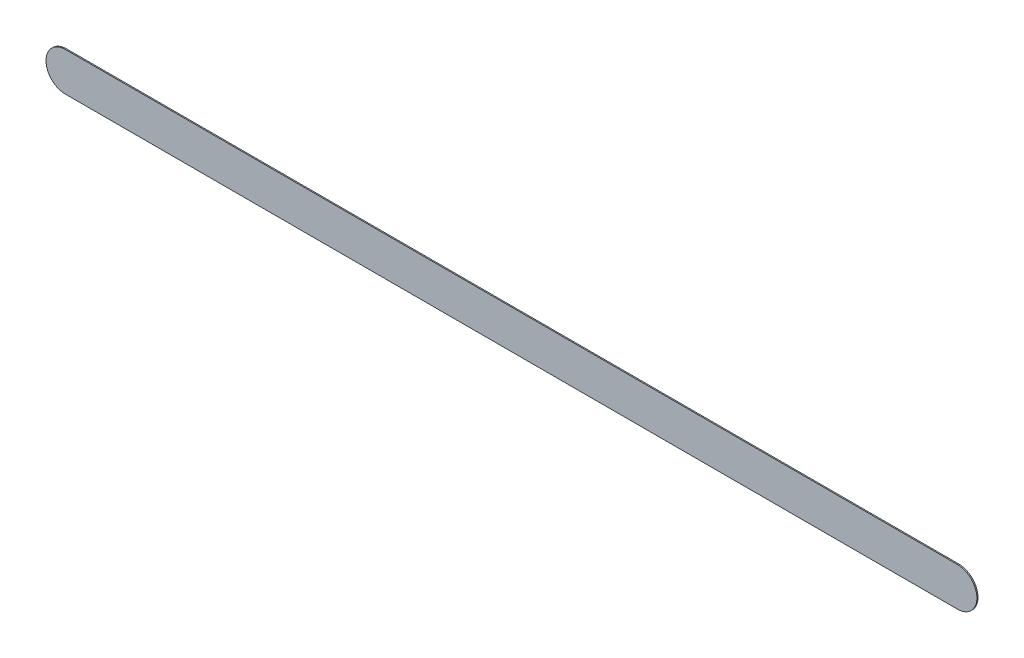
ISO-10303-21;
HEADER;
FILE_DESCRIPTION(('STEP AP214'),'2;1');
FILE_NAME('part.step','',(''),(''),'','','');
FILE_SCHEMA(('AUTOMOTIVE_DESIGN { 1 0 10303 214 1 1 1 1 }'));
ENDSEC;
DATA;
#1=APPLICATION_CONTEXT('core data for automotive mechanical design processes');
#2=APPLICATION_PROTOCOL_DEFINITION('international standard','automotive_design',2000,#1);
#3=PRODUCT_CONTEXT('',#1,'mechanical');
#4=PRODUCT('Part','Part','',(#3));
#5=PRODUCT_RELATED_PRODUCT_CATEGORY('part','',(#4));
#6=PRODUCT_DEFINITION_FORMATION('','',#4);
#7=PRODUCT_DEFINITION_CONTEXT('part definition',#1,'design');
#8=PRODUCT_DEFINITION('design','',#6,#7);
#9=PRODUCT_DEFINITION_SHAPE('','',#8);
#10=(LENGTH_UNIT() NAMED_UNIT(*) SI_UNIT(.MILLI.,.METRE.));
#11=(NAMED_UNIT(*) PLANE_ANGLE_UNIT() SI_UNIT($,.RADIAN.));
#12=(NAMED_UNIT(*) SI_UNIT($,.STERADIAN.) SOLID_ANGLE_UNIT());
#13=UNCERTAINTY_MEASURE_WITH_UNIT(LENGTH_MEASURE(1.E-05),#10,'distance_accuracy_value','');
#14=(GEOMETRIC_REPRESENTATION_CONTEXT(3) GLOBAL_UNCERTAINTY_ASSIGNED_CONTEXT((#13)) GLOBAL_UNIT_ASSIGNED_CONTEXT((#10,
#11,#12)) REPRESENTATION_CONTEXT('',''));
#15=CARTESIAN_POINT('',(0.,0.,0.));
#16=DIRECTION('',(0.,0.,1.));
#17=DIRECTION('',(1.,0.,0.));
#18=AXIS2_PLACEMENT_3D('',#15,#16,#17);
#19=CARTESIAN_POINT('',(-2.75,0.85,1.635));
#20=DIRECTION('',(0.,0.,1.));
#21=DIRECTION('',(1.,0.,0.));
#22=AXIS2_PLACEMENT_3D('',#19,#20,#21);
#23=PLANE('',#22);
#24=DIRECTION('',(-1.,0.,0.));
#25=VECTOR('',#24,1.);
#26=CARTESIAN_POINT('',(-2.75,0.85,1.635));
#27=LINE('',#26,#25);
#28=CARTESIAN_POINT('',(-2.75,0.85,1.635));
#29=VERTEX_POINT('',#28);
#30=CARTESIAN_POINT('',(-30.425,0.85,1.635));
#31=VERTEX_POINT('',#30);
#32=EDGE_CURVE('E96',#29,#31,#27,.T.);
#33=ORIENTED_EDGE('',*,*,#32,.T.);
#34=CARTESIAN_POINT('',(-30.425,0.25,1.635));
#35=DIRECTION('',(0.,0.,1.));
#36=DIRECTION('',(0.,1.,0.));
#37=AXIS2_PLACEMENT_3D('',#34,#35,#36);
#38=CIRCLE('',#37,0.6);
#39=CARTESIAN_POINT('',(-30.425,-0.35,1.635));
#40=VERTEX_POINT('',#39);
#41=EDGE_CURVE('E78',#31,#40,#38,.T.);
#42=ORIENTED_EDGE('',*,*,#41,.T.);
#43=DIRECTION('',(1.,0.,0.));
#44=VECTOR('',#43,1.);
#45=CARTESIAN_POINT('',(-30.425,-0.35,1.635));
#46=LINE('',#45,#44);
#47=CARTESIAN_POINT('',(-2.75,-0.35,1.635));
#48=VERTEX_POINT('',#47);
#49=EDGE_CURVE('E81',#40,#48,#46,.T.);
#50=ORIENTED_EDGE('',*,*,#49,.T.);
#51=CARTESIAN_POINT('',(-2.75,0.25,1.635));
#52=DIRECTION('',(0.,0.,1.));
#53=DIRECTION('',(0.,-1.,0.));
#54=AXIS2_PLACEMENT_3D('',#51,#52,#53);
#55=CIRCLE('',#54,0.6);
#56=EDGE_CURVE('E11',#48,#29,#55,.T.);
#57=ORIENTED_EDGE('',*,*,#56,.T.);
#58=EDGE_LOOP('',(#33,#42,#50,#57));
#59=FACE_BOUND('',#58,.T.);
#60=ADVANCED_FACE('F16',(#59),#23,.T.);
#61=CARTESIAN_POINT('',(-2.75,0.85,1.6));
#62=DIRECTION('',(0.,0.,1.));
#63=DIRECTION('',(1.,0.,0.));
#64=AXIS2_PLACEMENT_3D('',#61,#62,#63);
#65=PLANE('',#64);
#66=CARTESIAN_POINT('',(-2.75,0.25,1.6));
#67=DIRECTION('',(0.,0.,1.));
#68=DIRECTION('',(0.,-1.,0.));
#69=AXIS2_PLACEMENT_3D('',#66,#67,#68);
#70=CIRCLE('',#69,0.6);
#71=CARTESIAN_POINT('',(-2.75,-0.35,1.6));
#72=VERTEX_POINT('',#71);
#73=CARTESIAN_POINT('',(-2.75,0.85,1.6));
#74=VERTEX_POINT('',#73);
#75=EDGE_CURVE('E26',#72,#74,#70,.T.);
#76=ORIENTED_EDGE('',*,*,#75,.F.);
#77=DIRECTION('',(1.,0.,0.));
#78=VECTOR('',#77,1.);
#79=CARTESIAN_POINT('',(-30.425,-0.35,1.6));
#80=LINE('',#79,#78);
#81=CARTESIAN_POINT('',(-30.425,-0.35,1.6));
#82=VERTEX_POINT('',#81);
#83=EDGE_CURVE('E68',#82,#72,#80,.T.);
#84=ORIENTED_EDGE('',*,*,#83,.F.);
#85=CARTESIAN_POINT('',(-30.425,0.25,1.6));
#86=DIRECTION('',(0.,0.,1.));
#87=DIRECTION('',(0.,1.,0.));
#88=AXIS2_PLACEMENT_3D('',#85,#86,#87);
#89=CIRCLE('',#88,0.6);
#90=CARTESIAN_POINT('',(-30.425,0.85,1.6));
#91=VERTEX_POINT('',#90);
#92=EDGE_CURVE('E72',#91,#82,#89,.T.);
#93=ORIENTED_EDGE('',*,*,#92,.F.);
#94=DIRECTION('',(-1.,0.,0.));
#95=VECTOR('',#94,1.);
#96=CARTESIAN_POINT('',(-2.75,0.85,1.6));
#97=LINE('',#96,#95);
#98=EDGE_CURVE('E112',#74,#91,#97,.T.);
#99=ORIENTED_EDGE('',*,*,#98,.F.);
#100=EDGE_LOOP('',(#76,#84,#93,#99));
#101=FACE_BOUND('',#100,.T.);
#102=ADVANCED_FACE('F70',(#101),#65,.F.);
#103=CARTESIAN_POINT('',(-2.75,0.25,1.6));
#104=DIRECTION('',(0.,0.,-1.));
#105=DIRECTION('',(0.,-1.,0.));
#106=AXIS2_PLACEMENT_3D('',#103,#104,#105);
#107=CYLINDRICAL_SURFACE('',#106,0.6);
#108=ORIENTED_EDGE('',*,*,#75,.T.);
#109=DIRECTION('',(0.,0.,1.));
#110=VECTOR('',#109,1.);
#111=CARTESIAN_POINT('',(-2.75,0.85,1.6));
#112=LINE('',#111,#110);
#113=EDGE_CURVE('E90',#74,#29,#112,.T.);
#114=ORIENTED_EDGE('',*,*,#113,.T.);
#115=ORIENTED_EDGE('',*,*,#56,.F.);
#116=DIRECTION('',(0.,0.,1.));
#117=VECTOR('',#116,1.);
#118=CARTESIAN_POINT('',(-2.75,-0.35,1.6));
#119=LINE('',#118,#117);
#120=EDGE_CURVE('E77',#72,#48,#119,.T.);
#121=ORIENTED_EDGE('',*,*,#120,.F.);
#122=EDGE_LOOP('',(#108,#114,#115,#121));
#123=FACE_BOUND('',#122,.T.);
#124=ADVANCED_FACE('F126',(#123),#107,.T.);
#125=CARTESIAN_POINT('',(-30.425,-0.35,1.6));
#126=DIRECTION('',(0.,1.,0.));
#127=DIRECTION('',(1.,0.,0.));
#128=AXIS2_PLACEMENT_3D('',#125,#126,#127);
#129=PLANE('',#128);
#130=ORIENTED_EDGE('',*,*,#83,.T.);
#131=ORIENTED_EDGE('',*,*,#120,.T.);
#132=ORIENTED_EDGE('',*,*,#49,.F.);
#133=DIRECTION('',(0.,0.,1.));
#134=VECTOR('',#133,1.);
#135=CARTESIAN_POINT('',(-30.425,-0.35,1.6));
#136=LINE('',#135,#134);
#137=EDGE_CURVE('E20',#82,#40,#136,.T.);
#138=ORIENTED_EDGE('',*,*,#137,.F.);
#139=EDGE_LOOP('',(#130,#131,#132,#138));
#140=FACE_BOUND('',#139,.T.);
#141=ADVANCED_FACE('F80',(#140),#129,.F.);
#142=CARTESIAN_POINT('',(-30.425,0.25,1.6));
#143=DIRECTION('',(0.,0.,-1.));
#144=DIRECTION('',(0.,1.,0.));
#145=AXIS2_PLACEMENT_3D('',#142,#143,#144);
#146=CYLINDRICAL_SURFACE('',#145,0.6);
#147=ORIENTED_EDGE('',*,*,#92,.T.);
#148=ORIENTED_EDGE('',*,*,#137,.T.);
#149=ORIENTED_EDGE('',*,*,#41,.F.);
#150=DIRECTION('',(0.,0.,1.));
#151=VECTOR('',#150,1.);
#152=CARTESIAN_POINT('',(-30.425,0.85,1.6));
#153=LINE('',#152,#151);
#154=EDGE_CURVE('E87',#91,#31,#153,.T.);
#155=ORIENTED_EDGE('',*,*,#154,.F.);
#156=EDGE_LOOP('',(#147,#148,#149,#155));
#157=FACE_BOUND('',#156,.T.);
#158=ADVANCED_FACE('F85',(#157),#146,.T.);
#159=CARTESIAN_POINT('',(-2.75,0.85,1.6));
#160=DIRECTION('',(0.,-1.,0.));
#161=DIRECTION('',(0.,0.,-1.));
#162=AXIS2_PLACEMENT_3D('',#159,#160,#161);
#163=PLANE('',#162);
#164=ORIENTED_EDGE('',*,*,#98,.T.);
#165=ORIENTED_EDGE('',*,*,#154,.T.);
#166=ORIENTED_EDGE('',*,*,#32,.F.);
#167=ORIENTED_EDGE('',*,*,#113,.F.);
#168=EDGE_LOOP('',(#164,#165,#166,#167));
#169=FACE_BOUND('',#168,.T.);
#170=ADVANCED_FACE('F18',(#169),#163,.F.);
#171=CLOSED_SHELL('',(#60,#102,#124,#141,#158,#170));
#172=MANIFOLD_SOLID_BREP('B1',#171);
#173=ADVANCED_BREP_SHAPE_REPRESENTATION('',(#18,#172),#14);
#174=SHAPE_DEFINITION_REPRESENTATION(#9,#173);
ENDSEC;
END-ISO-10303-21;
